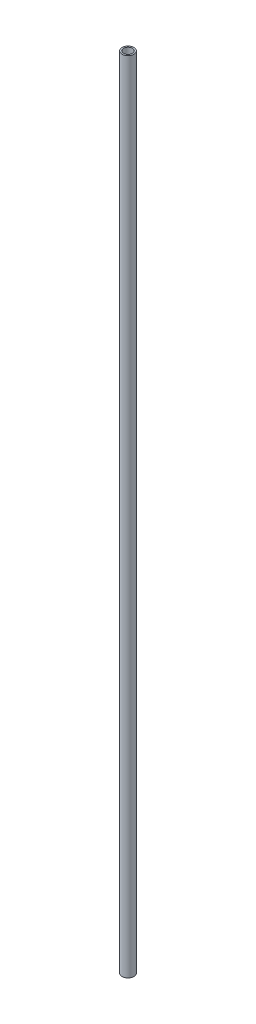
ISO-10303-21;
HEADER;
FILE_DESCRIPTION(('STEP AP214'),'2;1');
FILE_NAME('part.step','',(''),(''),'','','');
FILE_SCHEMA(('AUTOMOTIVE_DESIGN { 1 0 10303 214 1 1 1 1 }'));
ENDSEC;
DATA;
#1=APPLICATION_CONTEXT('core data for automotive mechanical design processes');
#2=APPLICATION_PROTOCOL_DEFINITION('international standard','automotive_design',2000,#1);
#3=PRODUCT_CONTEXT('',#1,'mechanical');
#4=PRODUCT('Part','Part','',(#3));
#5=PRODUCT_RELATED_PRODUCT_CATEGORY('part','',(#4));
#6=PRODUCT_DEFINITION_FORMATION('','',#4);
#7=PRODUCT_DEFINITION_CONTEXT('part definition',#1,'design');
#8=PRODUCT_DEFINITION('design','',#6,#7);
#9=PRODUCT_DEFINITION_SHAPE('','',#8);
#10=(LENGTH_UNIT() NAMED_UNIT(*) SI_UNIT(.MILLI.,.METRE.));
#11=(NAMED_UNIT(*) PLANE_ANGLE_UNIT() SI_UNIT($,.RADIAN.));
#12=(NAMED_UNIT(*) SI_UNIT($,.STERADIAN.) SOLID_ANGLE_UNIT());
#13=UNCERTAINTY_MEASURE_WITH_UNIT(LENGTH_MEASURE(1.E-05),#10,'distance_accuracy_value','');
#14=(GEOMETRIC_REPRESENTATION_CONTEXT(3) GLOBAL_UNCERTAINTY_ASSIGNED_CONTEXT((#13)) GLOBAL_UNIT_ASSIGNED_CONTEXT((#10,
#11,#12)) REPRESENTATION_CONTEXT('',''));
#15=CARTESIAN_POINT('',(0.,0.,0.));
#16=DIRECTION('',(0.,0.,1.));
#17=DIRECTION('',(1.,0.,0.));
#18=AXIS2_PLACEMENT_3D('',#15,#16,#17);
#19=CARTESIAN_POINT('',(0.,0.,0.));
#20=DIRECTION('',(0.,1.,0.));
#21=DIRECTION('',(0.,0.,1.));
#22=AXIS2_PLACEMENT_3D('',#19,#20,#21);
#23=CYLINDRICAL_SURFACE('',#22,4.);
#24=CARTESIAN_POINT('',(0.,540.,0.));
#25=DIRECTION('',(0.,1.,0.));
#26=DIRECTION('',(0.,0.,1.));
#27=AXIS2_PLACEMENT_3D('',#24,#25,#26);
#28=CIRCLE('',#27,4.);
#29=CARTESIAN_POINT('',(0.,540.,4.));
#30=VERTEX_POINT('',#29);
#31=EDGE_CURVE('E50',#30,#30,#28,.T.);
#32=ORIENTED_EDGE('',*,*,#31,.F.);
#33=EDGE_LOOP('',(#32));
#34=FACE_BOUND('',#33,.T.);
#35=CARTESIAN_POINT('',(0.,0.,0.));
#36=DIRECTION('',(0.,1.,0.));
#37=DIRECTION('',(0.,0.,1.));
#38=AXIS2_PLACEMENT_3D('',#35,#36,#37);
#39=CIRCLE('',#38,4.);
#40=CARTESIAN_POINT('',(0.,0.,4.));
#41=VERTEX_POINT('',#40);
#42=EDGE_CURVE('E35',#41,#41,#39,.T.);
#43=ORIENTED_EDGE('',*,*,#42,.T.);
#44=EDGE_LOOP('',(#43));
#45=FACE_BOUND('',#44,.T.);
#46=ADVANCED_FACE('F32',(#34,#45),#23,.T.);
#47=CARTESIAN_POINT('',(0.,0.,0.));
#48=DIRECTION('',(0.,1.,0.));
#49=DIRECTION('',(0.,0.,1.));
#50=AXIS2_PLACEMENT_3D('',#47,#48,#49);
#51=PLANE('',#50);
#52=CARTESIAN_POINT('',(0.,0.,0.));
#53=DIRECTION('',(0.,1.,0.));
#54=DIRECTION('',(0.,0.,1.));
#55=AXIS2_PLACEMENT_3D('',#52,#53,#54);
#56=CIRCLE('',#55,3.);
#57=CARTESIAN_POINT('',(0.,0.,3.));
#58=VERTEX_POINT('',#57);
#59=EDGE_CURVE('E40',#58,#58,#56,.F.);
#60=ORIENTED_EDGE('',*,*,#59,.F.);
#61=EDGE_LOOP('',(#60));
#62=FACE_BOUND('',#61,.T.);
#63=ORIENTED_EDGE('',*,*,#42,.F.);
#64=EDGE_LOOP('',(#63));
#65=FACE_BOUND('',#64,.T.);
#66=ADVANCED_FACE('F68',(#62,#65),#51,.F.);
#67=CARTESIAN_POINT('',(0.,540.,0.));
#68=DIRECTION('',(0.,1.,0.));
#69=DIRECTION('',(0.,0.,1.));
#70=AXIS2_PLACEMENT_3D('',#67,#68,#69);
#71=PLANE('',#70);
#72=CARTESIAN_POINT('',(0.,540.,0.));
#73=DIRECTION('',(0.,1.,0.));
#74=DIRECTION('',(0.,0.,1.));
#75=AXIS2_PLACEMENT_3D('',#72,#73,#74);
#76=CIRCLE('',#75,3.);
#77=CARTESIAN_POINT('',(0.,540.,3.));
#78=VERTEX_POINT('',#77);
#79=EDGE_CURVE('E11',#78,#78,#76,.F.);
#80=ORIENTED_EDGE('',*,*,#79,.T.);
#81=EDGE_LOOP('',(#80));
#82=FACE_BOUND('',#81,.T.);
#83=ORIENTED_EDGE('',*,*,#31,.T.);
#84=EDGE_LOOP('',(#83));
#85=FACE_BOUND('',#84,.T.);
#86=ADVANCED_FACE('F57',(#82,#85),#71,.T.);
#87=CARTESIAN_POINT('',(0.,0.,0.));
#88=DIRECTION('',(0.,1.,0.));
#89=DIRECTION('',(0.,0.,1.));
#90=AXIS2_PLACEMENT_3D('',#87,#88,#89);
#91=CYLINDRICAL_SURFACE('',#90,3.);
#92=ORIENTED_EDGE('',*,*,#79,.F.);
#93=EDGE_LOOP('',(#92));
#94=FACE_BOUND('',#93,.T.);
#95=ORIENTED_EDGE('',*,*,#59,.T.);
#96=EDGE_LOOP('',(#95));
#97=FACE_BOUND('',#96,.T.);
#98=ADVANCED_FACE('F60',(#94,#97),#91,.F.);
#99=CLOSED_SHELL('',(#46,#66,#86,#98));
#100=MANIFOLD_SOLID_BREP('B2',#99);
#101=ADVANCED_BREP_SHAPE_REPRESENTATION('',(#18,#100),#14);
#102=SHAPE_DEFINITION_REPRESENTATION(#9,#101);
ENDSEC;
END-ISO-10303-21;
